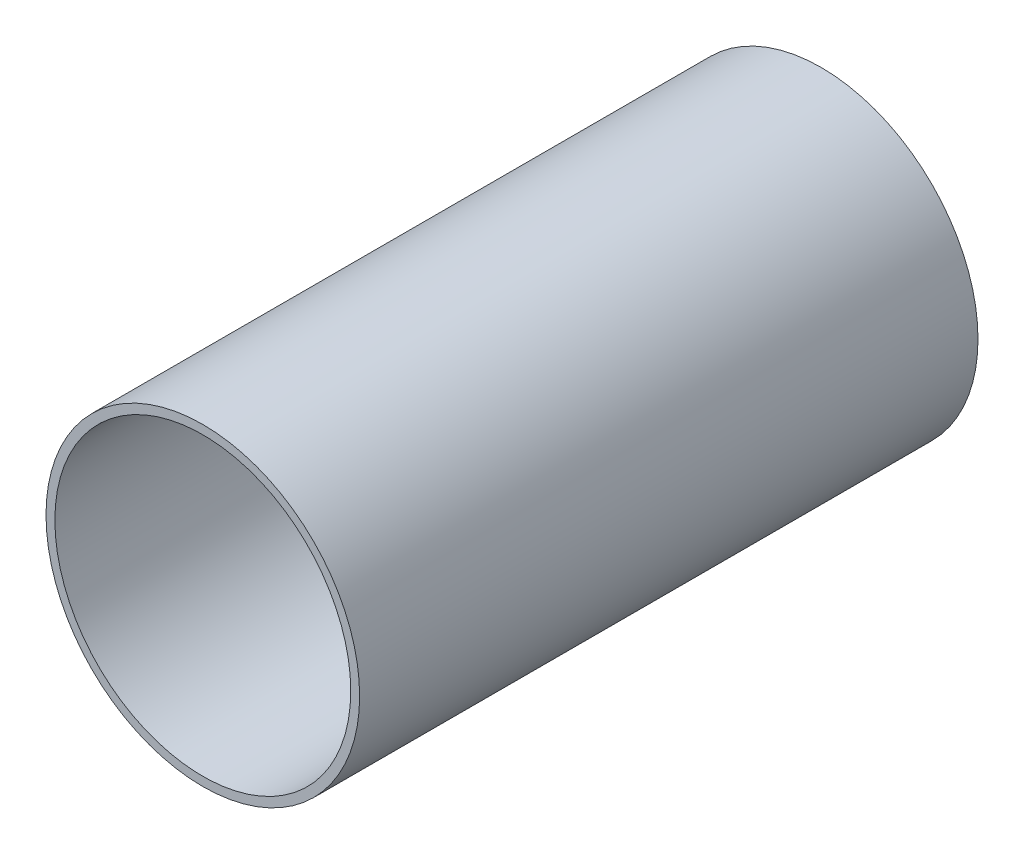
ISO-10303-21;
HEADER;
FILE_DESCRIPTION(('STEP AP214'),'2;1');
FILE_NAME('part.step','',(''),(''),'','','');
FILE_SCHEMA(('AUTOMOTIVE_DESIGN { 1 0 10303 214 1 1 1 1 }'));
ENDSEC;
DATA;
#1=APPLICATION_CONTEXT('core data for automotive mechanical design processes');
#2=APPLICATION_PROTOCOL_DEFINITION('international standard','automotive_design',2000,#1);
#3=PRODUCT_CONTEXT('',#1,'mechanical');
#4=PRODUCT('Part','Part','',(#3));
#5=PRODUCT_RELATED_PRODUCT_CATEGORY('part','',(#4));
#6=PRODUCT_DEFINITION_FORMATION('','',#4);
#7=PRODUCT_DEFINITION_CONTEXT('part definition',#1,'design');
#8=PRODUCT_DEFINITION('design','',#6,#7);
#9=PRODUCT_DEFINITION_SHAPE('','',#8);
#10=(LENGTH_UNIT() NAMED_UNIT(*) SI_UNIT(.MILLI.,.METRE.));
#11=(NAMED_UNIT(*) PLANE_ANGLE_UNIT() SI_UNIT($,.RADIAN.));
#12=(NAMED_UNIT(*) SI_UNIT($,.STERADIAN.) SOLID_ANGLE_UNIT());
#13=UNCERTAINTY_MEASURE_WITH_UNIT(LENGTH_MEASURE(1.E-05),#10,'distance_accuracy_value','');
#14=(GEOMETRIC_REPRESENTATION_CONTEXT(3) GLOBAL_UNCERTAINTY_ASSIGNED_CONTEXT((#13)) GLOBAL_UNIT_ASSIGNED_CONTEXT((#10,
#11,#12)) REPRESENTATION_CONTEXT('',''));
#15=CARTESIAN_POINT('',(0.,0.,0.));
#16=DIRECTION('',(0.,0.,1.));
#17=DIRECTION('',(1.,0.,0.));
#18=AXIS2_PLACEMENT_3D('',#15,#16,#17);
#19=CARTESIAN_POINT('',(0.,0.,0.));
#20=DIRECTION('',(0.,0.,1.));
#21=DIRECTION('',(1.,0.,0.));
#22=AXIS2_PLACEMENT_3D('',#19,#20,#21);
#23=CYLINDRICAL_SURFACE('',#22,50.);
#24=CARTESIAN_POINT('',(0.,0.,0.));
#25=DIRECTION('',(0.,0.,1.));
#26=DIRECTION('',(1.,0.,0.));
#27=AXIS2_PLACEMENT_3D('',#24,#25,#26);
#28=CIRCLE('',#27,50.);
#29=CARTESIAN_POINT('',(50.,0.,0.));
#30=VERTEX_POINT('',#29);
#31=EDGE_CURVE('E18',#30,#30,#28,.T.);
#32=ORIENTED_EDGE('',*,*,#31,.T.);
#33=EDGE_LOOP('',(#32));
#34=FACE_BOUND('',#33,.T.);
#35=CARTESIAN_POINT('',(0.,0.,-209.));
#36=DIRECTION('',(0.,0.,1.));
#37=DIRECTION('',(1.,0.,0.));
#38=AXIS2_PLACEMENT_3D('',#35,#36,#37);
#39=CIRCLE('',#38,50.);
#40=CARTESIAN_POINT('',(50.,0.,-209.));
#41=VERTEX_POINT('',#40);
#42=EDGE_CURVE('E27',#41,#41,#39,.T.);
#43=ORIENTED_EDGE('',*,*,#42,.F.);
#44=EDGE_LOOP('',(#43));
#45=FACE_BOUND('',#44,.T.);
#46=ADVANCED_FACE('F15',(#34,#45),#23,.F.);
#47=CARTESIAN_POINT('',(0.,0.,0.));
#48=DIRECTION('',(0.,0.,-1.));
#49=DIRECTION('',(-1.,0.,0.));
#50=AXIS2_PLACEMENT_3D('',#47,#48,#49);
#51=PLANE('',#50);
#52=ORIENTED_EDGE('',*,*,#31,.F.);
#53=EDGE_LOOP('',(#52));
#54=FACE_BOUND('',#53,.T.);
#55=CARTESIAN_POINT('',(0.,0.,0.));
#56=DIRECTION('',(0.,0.,1.));
#57=DIRECTION('',(1.,0.,0.));
#58=AXIS2_PLACEMENT_3D('',#55,#56,#57);
#59=CIRCLE('',#58,53.);
#60=CARTESIAN_POINT('',(53.,0.,0.));
#61=VERTEX_POINT('',#60);
#62=EDGE_CURVE('E22',#61,#61,#59,.F.);
#63=ORIENTED_EDGE('',*,*,#62,.F.);
#64=EDGE_LOOP('',(#63));
#65=FACE_BOUND('',#64,.T.);
#66=ADVANCED_FACE('F37',(#54,#65),#51,.F.);
#67=CARTESIAN_POINT('',(0.,0.,-209.));
#68=DIRECTION('',(0.,0.,-1.));
#69=DIRECTION('',(-1.,0.,0.));
#70=AXIS2_PLACEMENT_3D('',#67,#68,#69);
#71=PLANE('',#70);
#72=ORIENTED_EDGE('',*,*,#42,.T.);
#73=EDGE_LOOP('',(#72));
#74=FACE_BOUND('',#73,.T.);
#75=CARTESIAN_POINT('',(0.,0.,-209.));
#76=DIRECTION('',(0.,0.,1.));
#77=DIRECTION('',(1.,0.,0.));
#78=AXIS2_PLACEMENT_3D('',#75,#76,#77);
#79=CIRCLE('',#78,53.);
#80=CARTESIAN_POINT('',(53.,0.,-209.));
#81=VERTEX_POINT('',#80);
#82=EDGE_CURVE('E10',#81,#81,#79,.T.);
#83=ORIENTED_EDGE('',*,*,#82,.F.);
#84=EDGE_LOOP('',(#83));
#85=FACE_BOUND('',#84,.T.);
#86=ADVANCED_FACE('F40',(#74,#85),#71,.T.);
#87=CARTESIAN_POINT('',(0.,0.,0.));
#88=DIRECTION('',(0.,0.,1.));
#89=DIRECTION('',(1.,0.,0.));
#90=AXIS2_PLACEMENT_3D('',#87,#88,#89);
#91=CYLINDRICAL_SURFACE('',#90,53.);
#92=ORIENTED_EDGE('',*,*,#62,.T.);
#93=EDGE_LOOP('',(#92));
#94=FACE_BOUND('',#93,.T.);
#95=ORIENTED_EDGE('',*,*,#82,.T.);
#96=EDGE_LOOP('',(#95));
#97=FACE_BOUND('',#96,.T.);
#98=ADVANCED_FACE('F43',(#94,#97),#91,.T.);
#99=CLOSED_SHELL('',(#46,#66,#86,#98));
#100=MANIFOLD_SOLID_BREP('B1',#99);
#101=ADVANCED_BREP_SHAPE_REPRESENTATION('',(#18,#100),#14);
#102=SHAPE_DEFINITION_REPRESENTATION(#9,#101);
ENDSEC;
END-ISO-10303-21;
